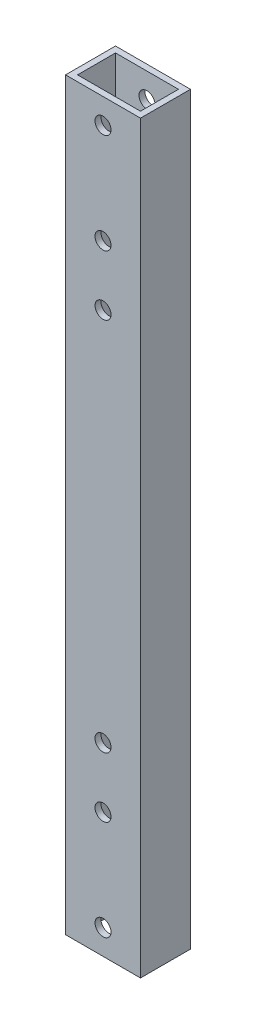
ISO-10303-21;
HEADER;
FILE_DESCRIPTION(('STEP AP214'),'2;1');
FILE_NAME('part.step','',(''),(''),'','','');
FILE_SCHEMA(('AUTOMOTIVE_DESIGN { 1 0 10303 214 1 1 1 1 }'));
ENDSEC;
DATA;
#1=APPLICATION_CONTEXT('core data for automotive mechanical design processes');
#2=APPLICATION_PROTOCOL_DEFINITION('international standard','automotive_design',2000,#1);
#3=PRODUCT_CONTEXT('',#1,'mechanical');
#4=PRODUCT('Part','Part','',(#3));
#5=PRODUCT_RELATED_PRODUCT_CATEGORY('part','',(#4));
#6=PRODUCT_DEFINITION_FORMATION('','',#4);
#7=PRODUCT_DEFINITION_CONTEXT('part definition',#1,'design');
#8=PRODUCT_DEFINITION('design','',#6,#7);
#9=PRODUCT_DEFINITION_SHAPE('','',#8);
#10=(LENGTH_UNIT() NAMED_UNIT(*) SI_UNIT(.MILLI.,.METRE.));
#11=(NAMED_UNIT(*) PLANE_ANGLE_UNIT() SI_UNIT($,.RADIAN.));
#12=(NAMED_UNIT(*) SI_UNIT($,.STERADIAN.) SOLID_ANGLE_UNIT());
#13=UNCERTAINTY_MEASURE_WITH_UNIT(LENGTH_MEASURE(1.E-05),#10,'distance_accuracy_value','');
#14=(GEOMETRIC_REPRESENTATION_CONTEXT(3) GLOBAL_UNCERTAINTY_ASSIGNED_CONTEXT((#13)) GLOBAL_UNIT_ASSIGNED_CONTEXT((#10,
#11,#12)) REPRESENTATION_CONTEXT('',''));
#15=CARTESIAN_POINT('',(0.,0.,0.));
#16=DIRECTION('',(0.,0.,1.));
#17=DIRECTION('',(1.,0.,0.));
#18=AXIS2_PLACEMENT_3D('',#15,#16,#17);
#19=CARTESIAN_POINT('',(0.,74.51,0.));
#20=DIRECTION('',(0.,1.,0.));
#21=DIRECTION('',(0.,0.,1.));
#22=AXIS2_PLACEMENT_3D('',#19,#20,#21);
#23=PLANE('',#22);
#24=DIRECTION('',(0.,0.,-1.));
#25=VECTOR('',#24,1.);
#26=CARTESIAN_POINT('',(7.5,74.51,-5.));
#27=LINE('',#26,#25);
#28=CARTESIAN_POINT('',(7.5,74.51,5.));
#29=VERTEX_POINT('',#28);
#30=CARTESIAN_POINT('',(7.5,74.51,-5.));
#31=VERTEX_POINT('',#30);
#32=EDGE_CURVE('E143',#29,#31,#27,.T.);
#33=ORIENTED_EDGE('',*,*,#32,.T.);
#34=DIRECTION('',(-1.,0.,0.));
#35=VECTOR('',#34,1.);
#36=CARTESIAN_POINT('',(-7.5,74.51,-5.));
#37=LINE('',#36,#35);
#38=CARTESIAN_POINT('',(-7.5,74.51,-5.));
#39=VERTEX_POINT('',#38);
#40=EDGE_CURVE('E146',#31,#39,#37,.T.);
#41=ORIENTED_EDGE('',*,*,#40,.T.);
#42=DIRECTION('',(0.,0.,1.));
#43=VECTOR('',#42,1.);
#44=CARTESIAN_POINT('',(-7.5,74.51,-5.));
#45=LINE('',#44,#43);
#46=CARTESIAN_POINT('',(-7.5,74.51,5.));
#47=VERTEX_POINT('',#46);
#48=EDGE_CURVE('E149',#39,#47,#45,.T.);
#49=ORIENTED_EDGE('',*,*,#48,.T.);
#50=DIRECTION('',(1.,0.,0.));
#51=VECTOR('',#50,1.);
#52=CARTESIAN_POINT('',(-7.5,74.51,5.));
#53=LINE('',#52,#51);
#54=EDGE_CURVE('E151',#47,#29,#53,.T.);
#55=ORIENTED_EDGE('',*,*,#54,.T.);
#56=EDGE_LOOP('',(#33,#41,#49,#55));
#57=FACE_BOUND('',#56,.T.);
#58=DIRECTION('',(1.,0.,0.));
#59=VECTOR('',#58,1.);
#60=CARTESIAN_POINT('',(-6.3,74.51,3.8));
#61=LINE('',#60,#59);
#62=CARTESIAN_POINT('',(-6.3,74.51,3.8));
#63=VERTEX_POINT('',#62);
#64=CARTESIAN_POINT('',(6.3,74.51,3.8));
#65=VERTEX_POINT('',#64);
#66=EDGE_CURVE('E113',#63,#65,#61,.T.);
#67=ORIENTED_EDGE('',*,*,#66,.F.);
#68=DIRECTION('',(0.,0.,1.));
#69=VECTOR('',#68,1.);
#70=CARTESIAN_POINT('',(-6.3,74.51,-3.8));
#71=LINE('',#70,#69);
#72=CARTESIAN_POINT('',(-6.3,74.51,-3.8));
#73=VERTEX_POINT('',#72);
#74=EDGE_CURVE('E105',#73,#63,#71,.T.);
#75=ORIENTED_EDGE('',*,*,#74,.F.);
#76=DIRECTION('',(-1.,0.,0.));
#77=VECTOR('',#76,1.);
#78=CARTESIAN_POINT('',(-6.3,74.51,-3.8));
#79=LINE('',#78,#77);
#80=CARTESIAN_POINT('',(6.3,74.51,-3.8));
#81=VERTEX_POINT('',#80);
#82=EDGE_CURVE('E127',#81,#73,#79,.T.);
#83=ORIENTED_EDGE('',*,*,#82,.F.);
#84=DIRECTION('',(0.,0.,-1.));
#85=VECTOR('',#84,1.);
#86=CARTESIAN_POINT('',(6.3,74.51,-3.8));
#87=LINE('',#86,#85);
#88=EDGE_CURVE('E125',#65,#81,#87,.T.);
#89=ORIENTED_EDGE('',*,*,#88,.F.);
#90=EDGE_LOOP('',(#67,#75,#83,#89));
#91=FACE_BOUND('',#90,.T.);
#92=ADVANCED_FACE('F38',(#57,#91),#23,.T.);
#93=CARTESIAN_POINT('',(0.,-74.51,0.));
#94=DIRECTION('',(0.,1.,0.));
#95=DIRECTION('',(0.,0.,1.));
#96=AXIS2_PLACEMENT_3D('',#93,#94,#95);
#97=PLANE('',#96);
#98=DIRECTION('',(0.,0.,-1.));
#99=VECTOR('',#98,1.);
#100=CARTESIAN_POINT('',(7.5,-74.51,-5.));
#101=LINE('',#100,#99);
#102=CARTESIAN_POINT('',(7.5,-74.51,5.));
#103=VERTEX_POINT('',#102);
#104=CARTESIAN_POINT('',(7.5,-74.51,-5.));
#105=VERTEX_POINT('',#104);
#106=EDGE_CURVE('E121',#103,#105,#101,.T.);
#107=ORIENTED_EDGE('',*,*,#106,.F.);
#108=DIRECTION('',(1.,0.,0.));
#109=VECTOR('',#108,1.);
#110=CARTESIAN_POINT('',(-7.5,-74.51,5.));
#111=LINE('',#110,#109);
#112=CARTESIAN_POINT('',(-7.5,-74.51,5.));
#113=VERTEX_POINT('',#112);
#114=EDGE_CURVE('E147',#113,#103,#111,.T.);
#115=ORIENTED_EDGE('',*,*,#114,.F.);
#116=DIRECTION('',(0.,0.,1.));
#117=VECTOR('',#116,1.);
#118=CARTESIAN_POINT('',(-7.5,-74.51,-5.));
#119=LINE('',#118,#117);
#120=CARTESIAN_POINT('',(-7.5,-74.51,-5.));
#121=VERTEX_POINT('',#120);
#122=EDGE_CURVE('E158',#121,#113,#119,.T.);
#123=ORIENTED_EDGE('',*,*,#122,.F.);
#124=DIRECTION('',(-1.,0.,0.));
#125=VECTOR('',#124,1.);
#126=CARTESIAN_POINT('',(-7.5,-74.51,-5.));
#127=LINE('',#126,#125);
#128=EDGE_CURVE('E156',#105,#121,#127,.T.);
#129=ORIENTED_EDGE('',*,*,#128,.F.);
#130=EDGE_LOOP('',(#107,#115,#123,#129));
#131=FACE_BOUND('',#130,.T.);
#132=DIRECTION('',(0.,0.,1.));
#133=VECTOR('',#132,1.);
#134=CARTESIAN_POINT('',(-6.3,-74.51,-3.8));
#135=LINE('',#134,#133);
#136=CARTESIAN_POINT('',(-6.3,-74.51,-3.8));
#137=VERTEX_POINT('',#136);
#138=CARTESIAN_POINT('',(-6.3,-74.51,3.8));
#139=VERTEX_POINT('',#138);
#140=EDGE_CURVE('E63',#137,#139,#135,.T.);
#141=ORIENTED_EDGE('',*,*,#140,.T.);
#142=DIRECTION('',(1.,0.,0.));
#143=VECTOR('',#142,1.);
#144=CARTESIAN_POINT('',(-6.3,-74.51,3.8));
#145=LINE('',#144,#143);
#146=CARTESIAN_POINT('',(6.3,-74.51,3.8));
#147=VERTEX_POINT('',#146);
#148=EDGE_CURVE('E120',#139,#147,#145,.T.);
#149=ORIENTED_EDGE('',*,*,#148,.T.);
#150=DIRECTION('',(0.,0.,-1.));
#151=VECTOR('',#150,1.);
#152=CARTESIAN_POINT('',(6.3,-74.51,-3.8));
#153=LINE('',#152,#151);
#154=CARTESIAN_POINT('',(6.3,-74.51,-3.8));
#155=VERTEX_POINT('',#154);
#156=EDGE_CURVE('E135',#147,#155,#153,.T.);
#157=ORIENTED_EDGE('',*,*,#156,.T.);
#158=DIRECTION('',(-1.,0.,0.));
#159=VECTOR('',#158,1.);
#160=CARTESIAN_POINT('',(-6.3,-74.51,-3.8));
#161=LINE('',#160,#159);
#162=EDGE_CURVE('E114',#155,#137,#161,.T.);
#163=ORIENTED_EDGE('',*,*,#162,.T.);
#164=EDGE_LOOP('',(#141,#149,#157,#163));
#165=FACE_BOUND('',#164,.T.);
#166=ADVANCED_FACE('F272',(#131,#165),#97,.F.);
#167=CARTESIAN_POINT('',(7.5,74.51,-5.));
#168=DIRECTION('',(-1.,0.,0.));
#169=DIRECTION('',(0.,0.,1.));
#170=AXIS2_PLACEMENT_3D('',#167,#168,#169);
#171=PLANE('',#170);
#172=ORIENTED_EDGE('',*,*,#106,.T.);
#173=DIRECTION('',(0.,-1.,0.));
#174=VECTOR('',#173,1.);
#175=CARTESIAN_POINT('',(7.5,74.51,-5.));
#176=LINE('',#175,#174);
#177=EDGE_CURVE('E11',#31,#105,#176,.T.);
#178=ORIENTED_EDGE('',*,*,#177,.F.);
#179=ORIENTED_EDGE('',*,*,#32,.F.);
#180=DIRECTION('',(0.,-1.,0.));
#181=VECTOR('',#180,1.);
#182=CARTESIAN_POINT('',(7.5,74.51,5.));
#183=LINE('',#182,#181);
#184=EDGE_CURVE('E153',#29,#103,#183,.T.);
#185=ORIENTED_EDGE('',*,*,#184,.T.);
#186=EDGE_LOOP('',(#172,#178,#179,#185));
#187=FACE_BOUND('',#186,.T.);
#188=ADVANCED_FACE('F40',(#187),#171,.F.);
#189=CARTESIAN_POINT('',(-7.5,74.51,-5.));
#190=DIRECTION('',(0.,0.,1.));
#191=DIRECTION('',(1.,0.,0.));
#192=AXIS2_PLACEMENT_3D('',#189,#190,#191);
#193=PLANE('',#192);
#194=CARTESIAN_POINT('',(0.,37.5,-5.));
#195=DIRECTION('',(0.,0.,-1.));
#196=DIRECTION('',(-1.,0.,0.));
#197=AXIS2_PLACEMENT_3D('',#194,#195,#196);
#198=CIRCLE('',#197,1.6);
#199=CARTESIAN_POINT('',(-1.6,37.5,-5.));
#200=VERTEX_POINT('',#199);
#201=EDGE_CURVE('E193',#200,#200,#198,.T.);
#202=ORIENTED_EDGE('',*,*,#201,.F.);
#203=EDGE_LOOP('',(#202));
#204=FACE_BOUND('',#203,.T.);
#205=CARTESIAN_POINT('',(0.,-37.5,-5.));
#206=DIRECTION('',(0.,0.,-1.));
#207=DIRECTION('',(1.,0.,0.));
#208=AXIS2_PLACEMENT_3D('',#205,#206,#207);
#209=CIRCLE('',#208,1.6);
#210=CARTESIAN_POINT('',(1.6,-37.5,-5.));
#211=VERTEX_POINT('',#210);
#212=EDGE_CURVE('E198',#211,#211,#209,.T.);
#213=ORIENTED_EDGE('',*,*,#212,.F.);
#214=EDGE_LOOP('',(#213));
#215=FACE_BOUND('',#214,.T.);
#216=CARTESIAN_POINT('',(0.,-49.51,-5.));
#217=DIRECTION('',(0.,0.,-1.));
#218=DIRECTION('',(1.,0.,0.));
#219=AXIS2_PLACEMENT_3D('',#216,#217,#218);
#220=CIRCLE('',#219,1.6);
#221=CARTESIAN_POINT('',(1.6,-49.51,-5.));
#222=VERTEX_POINT('',#221);
#223=EDGE_CURVE('E180',#222,#222,#220,.T.);
#224=ORIENTED_EDGE('',*,*,#223,.F.);
#225=EDGE_LOOP('',(#224));
#226=FACE_BOUND('',#225,.T.);
#227=CARTESIAN_POINT('',(0.,-69.51,-5.));
#228=DIRECTION('',(0.,0.,-1.));
#229=DIRECTION('',(1.,0.,0.));
#230=AXIS2_PLACEMENT_3D('',#227,#228,#229);
#231=CIRCLE('',#230,1.6);
#232=CARTESIAN_POINT('',(1.6,-69.51,-5.));
#233=VERTEX_POINT('',#232);
#234=EDGE_CURVE('E215',#233,#233,#231,.T.);
#235=ORIENTED_EDGE('',*,*,#234,.F.);
#236=EDGE_LOOP('',(#235));
#237=FACE_BOUND('',#236,.T.);
#238=CARTESIAN_POINT('',(0.,49.51,-5.));
#239=DIRECTION('',(0.,0.,1.));
#240=DIRECTION('',(1.,0.,0.));
#241=AXIS2_PLACEMENT_3D('',#238,#239,#240);
#242=CIRCLE('',#241,1.6);
#243=CARTESIAN_POINT('',(1.6,49.51,-5.));
#244=VERTEX_POINT('',#243);
#245=EDGE_CURVE('E172',#244,#244,#242,.T.);
#246=ORIENTED_EDGE('',*,*,#245,.T.);
#247=EDGE_LOOP('',(#246));
#248=FACE_BOUND('',#247,.T.);
#249=CARTESIAN_POINT('',(0.,69.51,-5.));
#250=DIRECTION('',(0.,0.,1.));
#251=DIRECTION('',(1.,0.,0.));
#252=AXIS2_PLACEMENT_3D('',#249,#250,#251);
#253=CIRCLE('',#252,1.6);
#254=CARTESIAN_POINT('',(1.6,69.51,-5.));
#255=VERTEX_POINT('',#254);
#256=EDGE_CURVE('E230',#255,#255,#253,.T.);
#257=ORIENTED_EDGE('',*,*,#256,.T.);
#258=EDGE_LOOP('',(#257));
#259=FACE_BOUND('',#258,.T.);
#260=ORIENTED_EDGE('',*,*,#128,.T.);
#261=DIRECTION('',(0.,-1.,0.));
#262=VECTOR('',#261,1.);
#263=CARTESIAN_POINT('',(-7.5,74.51,-5.));
#264=LINE('',#263,#262);
#265=EDGE_CURVE('E47',#39,#121,#264,.T.);
#266=ORIENTED_EDGE('',*,*,#265,.F.);
#267=ORIENTED_EDGE('',*,*,#40,.F.);
#268=ORIENTED_EDGE('',*,*,#177,.T.);
#269=EDGE_LOOP('',(#260,#266,#267,#268));
#270=FACE_BOUND('',#269,.T.);
#271=ADVANCED_FACE('F276',(#204,#215,#226,#237,#248,#259,#270),#193,.F.);
#272=CARTESIAN_POINT('',(-7.5,74.51,-5.));
#273=DIRECTION('',(1.,0.,0.));
#274=DIRECTION('',(0.,0.,-1.));
#275=AXIS2_PLACEMENT_3D('',#272,#273,#274);
#276=PLANE('',#275);
#277=ORIENTED_EDGE('',*,*,#122,.T.);
#278=DIRECTION('',(0.,-1.,0.));
#279=VECTOR('',#278,1.);
#280=CARTESIAN_POINT('',(-7.5,74.51,5.));
#281=LINE('',#280,#279);
#282=EDGE_CURVE('E163',#47,#113,#281,.T.);
#283=ORIENTED_EDGE('',*,*,#282,.F.);
#284=ORIENTED_EDGE('',*,*,#48,.F.);
#285=ORIENTED_EDGE('',*,*,#265,.T.);
#286=EDGE_LOOP('',(#277,#283,#284,#285));
#287=FACE_BOUND('',#286,.T.);
#288=ADVANCED_FACE('F260',(#287),#276,.F.);
#289=CARTESIAN_POINT('',(-7.5,74.51,5.));
#290=DIRECTION('',(0.,0.,-1.));
#291=DIRECTION('',(-1.,0.,0.));
#292=AXIS2_PLACEMENT_3D('',#289,#290,#291);
#293=PLANE('',#292);
#294=CARTESIAN_POINT('',(0.,37.5,5.));
#295=DIRECTION('',(0.,0.,-1.));
#296=DIRECTION('',(-1.,0.,0.));
#297=AXIS2_PLACEMENT_3D('',#294,#295,#296);
#298=CIRCLE('',#297,1.6);
#299=CARTESIAN_POINT('',(-1.6,37.5,5.));
#300=VERTEX_POINT('',#299);
#301=EDGE_CURVE('E187',#300,#300,#298,.T.);
#302=ORIENTED_EDGE('',*,*,#301,.T.);
#303=EDGE_LOOP('',(#302));
#304=FACE_BOUND('',#303,.T.);
#305=CARTESIAN_POINT('',(0.,-37.5,5.));
#306=DIRECTION('',(0.,0.,-1.));
#307=DIRECTION('',(1.,0.,0.));
#308=AXIS2_PLACEMENT_3D('',#305,#306,#307);
#309=CIRCLE('',#308,1.6);
#310=CARTESIAN_POINT('',(1.6,-37.5,5.));
#311=VERTEX_POINT('',#310);
#312=EDGE_CURVE('E203',#311,#311,#309,.T.);
#313=ORIENTED_EDGE('',*,*,#312,.T.);
#314=EDGE_LOOP('',(#313));
#315=FACE_BOUND('',#314,.T.);
#316=CARTESIAN_POINT('',(0.,-49.51,5.));
#317=DIRECTION('',(0.,0.,-1.));
#318=DIRECTION('',(1.,0.,0.));
#319=AXIS2_PLACEMENT_3D('',#316,#317,#318);
#320=CIRCLE('',#319,1.6);
#321=CARTESIAN_POINT('',(1.6,-49.51,5.));
#322=VERTEX_POINT('',#321);
#323=EDGE_CURVE('E212',#322,#322,#320,.T.);
#324=ORIENTED_EDGE('',*,*,#323,.T.);
#325=EDGE_LOOP('',(#324));
#326=FACE_BOUND('',#325,.T.);
#327=CARTESIAN_POINT('',(0.,-69.51,5.));
#328=DIRECTION('',(0.,0.,-1.));
#329=DIRECTION('',(1.,0.,0.));
#330=AXIS2_PLACEMENT_3D('',#327,#328,#329);
#331=CIRCLE('',#330,1.6);
#332=CARTESIAN_POINT('',(1.6,-69.51,5.));
#333=VERTEX_POINT('',#332);
#334=EDGE_CURVE('E209',#333,#333,#331,.T.);
#335=ORIENTED_EDGE('',*,*,#334,.T.);
#336=EDGE_LOOP('',(#335));
#337=FACE_BOUND('',#336,.T.);
#338=CARTESIAN_POINT('',(0.,49.51,5.));
#339=DIRECTION('',(0.,0.,1.));
#340=DIRECTION('',(1.,0.,0.));
#341=AXIS2_PLACEMENT_3D('',#338,#339,#340);
#342=CIRCLE('',#341,1.6);
#343=CARTESIAN_POINT('',(1.6,49.51,5.));
#344=VERTEX_POINT('',#343);
#345=EDGE_CURVE('E227',#344,#344,#342,.T.);
#346=ORIENTED_EDGE('',*,*,#345,.F.);
#347=EDGE_LOOP('',(#346));
#348=FACE_BOUND('',#347,.T.);
#349=CARTESIAN_POINT('',(0.,69.51,5.));
#350=DIRECTION('',(0.,0.,1.));
#351=DIRECTION('',(1.,0.,0.));
#352=AXIS2_PLACEMENT_3D('',#349,#350,#351);
#353=CIRCLE('',#352,1.6);
#354=CARTESIAN_POINT('',(1.6,69.51,5.));
#355=VERTEX_POINT('',#354);
#356=EDGE_CURVE('E224',#355,#355,#353,.T.);
#357=ORIENTED_EDGE('',*,*,#356,.F.);
#358=EDGE_LOOP('',(#357));
#359=FACE_BOUND('',#358,.T.);
#360=ORIENTED_EDGE('',*,*,#114,.T.);
#361=ORIENTED_EDGE('',*,*,#184,.F.);
#362=ORIENTED_EDGE('',*,*,#54,.F.);
#363=ORIENTED_EDGE('',*,*,#282,.T.);
#364=EDGE_LOOP('',(#360,#361,#362,#363));
#365=FACE_BOUND('',#364,.T.);
#366=ADVANCED_FACE('F257',(#304,#315,#326,#337,#348,#359,#365),#293,.F.);
#367=CARTESIAN_POINT('',(-6.3,74.51,-3.8));
#368=DIRECTION('',(1.,0.,0.));
#369=DIRECTION('',(0.,0.,-1.));
#370=AXIS2_PLACEMENT_3D('',#367,#368,#369);
#371=PLANE('',#370);
#372=ORIENTED_EDGE('',*,*,#140,.F.);
#373=DIRECTION('',(0.,-1.,0.));
#374=VECTOR('',#373,1.);
#375=CARTESIAN_POINT('',(-6.3,74.51,-3.8));
#376=LINE('',#375,#374);
#377=EDGE_CURVE('E109',#73,#137,#376,.T.);
#378=ORIENTED_EDGE('',*,*,#377,.F.);
#379=ORIENTED_EDGE('',*,*,#74,.T.);
#380=DIRECTION('',(0.,-1.,0.));
#381=VECTOR('',#380,1.);
#382=CARTESIAN_POINT('',(-6.3,74.51,3.8));
#383=LINE('',#382,#381);
#384=EDGE_CURVE('E108',#63,#139,#383,.T.);
#385=ORIENTED_EDGE('',*,*,#384,.T.);
#386=EDGE_LOOP('',(#372,#378,#379,#385));
#387=FACE_BOUND('',#386,.T.);
#388=ADVANCED_FACE('F107',(#387),#371,.T.);
#389=CARTESIAN_POINT('',(-6.3,74.51,3.8));
#390=DIRECTION('',(0.,0.,-1.));
#391=DIRECTION('',(-1.,0.,0.));
#392=AXIS2_PLACEMENT_3D('',#389,#390,#391);
#393=PLANE('',#392);
#394=CARTESIAN_POINT('',(0.,37.5,3.8));
#395=DIRECTION('',(0.,0.,-1.));
#396=DIRECTION('',(-1.,0.,0.));
#397=AXIS2_PLACEMENT_3D('',#394,#395,#396);
#398=CIRCLE('',#397,1.6);
#399=CARTESIAN_POINT('',(-1.6,37.5,3.8));
#400=VERTEX_POINT('',#399);
#401=EDGE_CURVE('E206',#400,#400,#398,.T.);
#402=ORIENTED_EDGE('',*,*,#401,.F.);
#403=EDGE_LOOP('',(#402));
#404=FACE_BOUND('',#403,.T.);
#405=CARTESIAN_POINT('',(0.,-37.5,3.8));
#406=DIRECTION('',(0.,0.,-1.));
#407=DIRECTION('',(-1.,0.,0.));
#408=AXIS2_PLACEMENT_3D('',#405,#406,#407);
#409=CIRCLE('',#408,1.6);
#410=CARTESIAN_POINT('',(-1.6,-37.5,3.8));
#411=VERTEX_POINT('',#410);
#412=EDGE_CURVE('E186',#411,#411,#409,.T.);
#413=ORIENTED_EDGE('',*,*,#412,.F.);
#414=EDGE_LOOP('',(#413));
#415=FACE_BOUND('',#414,.T.);
#416=CARTESIAN_POINT('',(0.,-49.51,3.8));
#417=DIRECTION('',(0.,0.,-1.));
#418=DIRECTION('',(-1.,0.,0.));
#419=AXIS2_PLACEMENT_3D('',#416,#417,#418);
#420=CIRCLE('',#419,1.6);
#421=CARTESIAN_POINT('',(-1.6,-49.51,3.8));
#422=VERTEX_POINT('',#421);
#423=EDGE_CURVE('E183',#422,#422,#420,.F.);
#424=ORIENTED_EDGE('',*,*,#423,.T.);
#425=EDGE_LOOP('',(#424));
#426=FACE_BOUND('',#425,.T.);
#427=CARTESIAN_POINT('',(0.,-69.51,3.8));
#428=DIRECTION('',(0.,0.,-1.));
#429=DIRECTION('',(-1.,0.,0.));
#430=AXIS2_PLACEMENT_3D('',#427,#428,#429);
#431=CIRCLE('',#430,1.6);
#432=CARTESIAN_POINT('',(-1.6,-69.51,3.8));
#433=VERTEX_POINT('',#432);
#434=EDGE_CURVE('E179',#433,#433,#431,.F.);
#435=ORIENTED_EDGE('',*,*,#434,.T.);
#436=EDGE_LOOP('',(#435));
#437=FACE_BOUND('',#436,.T.);
#438=CARTESIAN_POINT('',(0.,49.51,3.8));
#439=DIRECTION('',(0.,0.,-1.));
#440=DIRECTION('',(-1.,0.,0.));
#441=AXIS2_PLACEMENT_3D('',#438,#439,#440);
#442=CIRCLE('',#441,1.6);
#443=CARTESIAN_POINT('',(-1.6,49.51,3.8));
#444=VERTEX_POINT('',#443);
#445=EDGE_CURVE('E133',#444,#444,#442,.T.);
#446=ORIENTED_EDGE('',*,*,#445,.F.);
#447=EDGE_LOOP('',(#446));
#448=FACE_BOUND('',#447,.T.);
#449=CARTESIAN_POINT('',(0.,69.51,3.8));
#450=DIRECTION('',(0.,0.,-1.));
#451=DIRECTION('',(-1.,0.,0.));
#452=AXIS2_PLACEMENT_3D('',#449,#450,#451);
#453=CIRCLE('',#452,1.6);
#454=CARTESIAN_POINT('',(-1.6,69.51,3.8));
#455=VERTEX_POINT('',#454);
#456=EDGE_CURVE('E171',#455,#455,#453,.T.);
#457=ORIENTED_EDGE('',*,*,#456,.F.);
#458=EDGE_LOOP('',(#457));
#459=FACE_BOUND('',#458,.T.);
#460=ORIENTED_EDGE('',*,*,#148,.F.);
#461=ORIENTED_EDGE('',*,*,#384,.F.);
#462=ORIENTED_EDGE('',*,*,#66,.T.);
#463=DIRECTION('',(0.,-1.,0.));
#464=VECTOR('',#463,1.);
#465=CARTESIAN_POINT('',(6.3,74.51,3.8));
#466=LINE('',#465,#464);
#467=EDGE_CURVE('E122',#65,#147,#466,.T.);
#468=ORIENTED_EDGE('',*,*,#467,.T.);
#469=EDGE_LOOP('',(#460,#461,#462,#468));
#470=FACE_BOUND('',#469,.T.);
#471=ADVANCED_FACE('F117',(#404,#415,#426,#437,#448,#459,#470),#393,.T.);
#472=CARTESIAN_POINT('',(6.3,74.51,-3.8));
#473=DIRECTION('',(-1.,0.,0.));
#474=DIRECTION('',(0.,0.,1.));
#475=AXIS2_PLACEMENT_3D('',#472,#473,#474);
#476=PLANE('',#475);
#477=ORIENTED_EDGE('',*,*,#156,.F.);
#478=ORIENTED_EDGE('',*,*,#467,.F.);
#479=ORIENTED_EDGE('',*,*,#88,.T.);
#480=DIRECTION('',(0.,-1.,0.));
#481=VECTOR('',#480,1.);
#482=CARTESIAN_POINT('',(6.3,74.51,-3.8));
#483=LINE('',#482,#481);
#484=EDGE_CURVE('E55',#81,#155,#483,.T.);
#485=ORIENTED_EDGE('',*,*,#484,.T.);
#486=EDGE_LOOP('',(#477,#478,#479,#485));
#487=FACE_BOUND('',#486,.T.);
#488=ADVANCED_FACE('F244',(#487),#476,.T.);
#489=CARTESIAN_POINT('',(-6.3,74.51,-3.8));
#490=DIRECTION('',(0.,0.,1.));
#491=DIRECTION('',(1.,0.,0.));
#492=AXIS2_PLACEMENT_3D('',#489,#490,#491);
#493=PLANE('',#492);
#494=CARTESIAN_POINT('',(0.,37.5,-3.8));
#495=DIRECTION('',(0.,0.,1.));
#496=DIRECTION('',(1.,0.,0.));
#497=AXIS2_PLACEMENT_3D('',#494,#495,#496);
#498=CIRCLE('',#497,1.6);
#499=CARTESIAN_POINT('',(1.6,37.5,-3.8));
#500=VERTEX_POINT('',#499);
#501=EDGE_CURVE('E42',#500,#500,#498,.T.);
#502=ORIENTED_EDGE('',*,*,#501,.F.);
#503=EDGE_LOOP('',(#502));
#504=FACE_BOUND('',#503,.T.);
#505=CARTESIAN_POINT('',(0.,-37.5,-3.8));
#506=DIRECTION('',(0.,0.,1.));
#507=DIRECTION('',(1.,0.,0.));
#508=AXIS2_PLACEMENT_3D('',#505,#506,#507);
#509=CIRCLE('',#508,1.6);
#510=CARTESIAN_POINT('',(1.6,-37.5,-3.8));
#511=VERTEX_POINT('',#510);
#512=EDGE_CURVE('E184',#511,#511,#509,.T.);
#513=ORIENTED_EDGE('',*,*,#512,.F.);
#514=EDGE_LOOP('',(#513));
#515=FACE_BOUND('',#514,.T.);
#516=CARTESIAN_POINT('',(0.,-49.51,-3.8));
#517=DIRECTION('',(0.,0.,1.));
#518=DIRECTION('',(1.,0.,0.));
#519=AXIS2_PLACEMENT_3D('',#516,#517,#518);
#520=CIRCLE('',#519,1.6);
#521=CARTESIAN_POINT('',(1.6,-49.51,-3.8));
#522=VERTEX_POINT('',#521);
#523=EDGE_CURVE('E181',#522,#522,#520,.F.);
#524=ORIENTED_EDGE('',*,*,#523,.T.);
#525=EDGE_LOOP('',(#524));
#526=FACE_BOUND('',#525,.T.);
#527=CARTESIAN_POINT('',(0.,-69.51,-3.8));
#528=DIRECTION('',(0.,0.,1.));
#529=DIRECTION('',(1.,0.,0.));
#530=AXIS2_PLACEMENT_3D('',#527,#528,#529);
#531=CIRCLE('',#530,1.6);
#532=CARTESIAN_POINT('',(1.6,-69.51,-3.8));
#533=VERTEX_POINT('',#532);
#534=EDGE_CURVE('E176',#533,#533,#531,.F.);
#535=ORIENTED_EDGE('',*,*,#534,.T.);
#536=EDGE_LOOP('',(#535));
#537=FACE_BOUND('',#536,.T.);
#538=CARTESIAN_POINT('',(0.,49.51,-3.8));
#539=DIRECTION('',(0.,0.,1.));
#540=DIRECTION('',(1.,0.,0.));
#541=AXIS2_PLACEMENT_3D('',#538,#539,#540);
#542=CIRCLE('',#541,1.6);
#543=CARTESIAN_POINT('',(1.6,49.51,-3.8));
#544=VERTEX_POINT('',#543);
#545=EDGE_CURVE('E173',#544,#544,#542,.T.);
#546=ORIENTED_EDGE('',*,*,#545,.F.);
#547=EDGE_LOOP('',(#546));
#548=FACE_BOUND('',#547,.T.);
#549=CARTESIAN_POINT('',(0.,69.51,-3.8));
#550=DIRECTION('',(0.,0.,1.));
#551=DIRECTION('',(1.,0.,0.));
#552=AXIS2_PLACEMENT_3D('',#549,#550,#551);
#553=CIRCLE('',#552,1.6);
#554=CARTESIAN_POINT('',(1.6,69.51,-3.8));
#555=VERTEX_POINT('',#554);
#556=EDGE_CURVE('E168',#555,#555,#553,.T.);
#557=ORIENTED_EDGE('',*,*,#556,.F.);
#558=EDGE_LOOP('',(#557));
#559=FACE_BOUND('',#558,.T.);
#560=ORIENTED_EDGE('',*,*,#162,.F.);
#561=ORIENTED_EDGE('',*,*,#484,.F.);
#562=ORIENTED_EDGE('',*,*,#82,.T.);
#563=ORIENTED_EDGE('',*,*,#377,.T.);
#564=EDGE_LOOP('',(#560,#561,#562,#563));
#565=FACE_BOUND('',#564,.T.);
#566=ADVANCED_FACE('F298',(#504,#515,#526,#537,#548,#559,#565),#493,.T.);
#567=CARTESIAN_POINT('',(0.,69.51,-5.));
#568=DIRECTION('',(0.,0.,1.));
#569=DIRECTION('',(1.,0.,0.));
#570=AXIS2_PLACEMENT_3D('',#567,#568,#569);
#571=CYLINDRICAL_SURFACE('',#570,1.6);
#572=ORIENTED_EDGE('',*,*,#556,.T.);
#573=EDGE_LOOP('',(#572));
#574=FACE_BOUND('',#573,.T.);
#575=ORIENTED_EDGE('',*,*,#256,.F.);
#576=EDGE_LOOP('',(#575));
#577=FACE_BOUND('',#576,.T.);
#578=ADVANCED_FACE('F254',(#574,#577),#571,.F.);
#579=CARTESIAN_POINT('',(0.,49.51,-5.));
#580=DIRECTION('',(0.,0.,1.));
#581=DIRECTION('',(1.,0.,0.));
#582=AXIS2_PLACEMENT_3D('',#579,#580,#581);
#583=CYLINDRICAL_SURFACE('',#582,1.6);
#584=ORIENTED_EDGE('',*,*,#545,.T.);
#585=EDGE_LOOP('',(#584));
#586=FACE_BOUND('',#585,.T.);
#587=ORIENTED_EDGE('',*,*,#245,.F.);
#588=EDGE_LOOP('',(#587));
#589=FACE_BOUND('',#588,.T.);
#590=ADVANCED_FACE('F252',(#586,#589),#583,.F.);
#591=ORIENTED_EDGE('',*,*,#456,.T.);
#592=EDGE_LOOP('',(#591));
#593=FACE_BOUND('',#592,.T.);
#594=ORIENTED_EDGE('',*,*,#356,.T.);
#595=EDGE_LOOP('',(#594));
#596=FACE_BOUND('',#595,.T.);
#597=ADVANCED_FACE('F249',(#593,#596),#571,.F.);
#598=ORIENTED_EDGE('',*,*,#445,.T.);
#599=EDGE_LOOP('',(#598));
#600=FACE_BOUND('',#599,.T.);
#601=ORIENTED_EDGE('',*,*,#345,.T.);
#602=EDGE_LOOP('',(#601));
#603=FACE_BOUND('',#602,.T.);
#604=ADVANCED_FACE('F239',(#600,#603),#583,.F.);
#605=CARTESIAN_POINT('',(0.,-69.51,-5.));
#606=DIRECTION('',(0.,0.,1.));
#607=DIRECTION('',(1.,0.,0.));
#608=AXIS2_PLACEMENT_3D('',#605,#606,#607);
#609=CYLINDRICAL_SURFACE('',#608,1.6);
#610=ORIENTED_EDGE('',*,*,#534,.F.);
#611=EDGE_LOOP('',(#610));
#612=FACE_BOUND('',#611,.T.);
#613=ORIENTED_EDGE('',*,*,#234,.T.);
#614=EDGE_LOOP('',(#613));
#615=FACE_BOUND('',#614,.T.);
#616=ADVANCED_FACE('F308',(#612,#615),#609,.F.);
#617=CARTESIAN_POINT('',(0.,-49.51,-5.));
#618=DIRECTION('',(0.,0.,1.));
#619=DIRECTION('',(1.,0.,0.));
#620=AXIS2_PLACEMENT_3D('',#617,#618,#619);
#621=CYLINDRICAL_SURFACE('',#620,1.6);
#622=ORIENTED_EDGE('',*,*,#523,.F.);
#623=EDGE_LOOP('',(#622));
#624=FACE_BOUND('',#623,.T.);
#625=ORIENTED_EDGE('',*,*,#223,.T.);
#626=EDGE_LOOP('',(#625));
#627=FACE_BOUND('',#626,.T.);
#628=ADVANCED_FACE('F311',(#624,#627),#621,.F.);
#629=ORIENTED_EDGE('',*,*,#434,.F.);
#630=EDGE_LOOP('',(#629));
#631=FACE_BOUND('',#630,.T.);
#632=ORIENTED_EDGE('',*,*,#334,.F.);
#633=EDGE_LOOP('',(#632));
#634=FACE_BOUND('',#633,.T.);
#635=ADVANCED_FACE('F313',(#631,#634),#609,.F.);
#636=ORIENTED_EDGE('',*,*,#423,.F.);
#637=EDGE_LOOP('',(#636));
#638=FACE_BOUND('',#637,.T.);
#639=ORIENTED_EDGE('',*,*,#323,.F.);
#640=EDGE_LOOP('',(#639));
#641=FACE_BOUND('',#640,.T.);
#642=ADVANCED_FACE('F317',(#638,#641),#621,.F.);
#643=CARTESIAN_POINT('',(0.,-37.5,5.));
#644=DIRECTION('',(0.,0.,-1.));
#645=DIRECTION('',(-1.,0.,0.));
#646=AXIS2_PLACEMENT_3D('',#643,#644,#645);
#647=CYLINDRICAL_SURFACE('',#646,1.6);
#648=ORIENTED_EDGE('',*,*,#512,.T.);
#649=EDGE_LOOP('',(#648));
#650=FACE_BOUND('',#649,.T.);
#651=ORIENTED_EDGE('',*,*,#212,.T.);
#652=EDGE_LOOP('',(#651));
#653=FACE_BOUND('',#652,.T.);
#654=ADVANCED_FACE('F318',(#650,#653),#647,.F.);
#655=CARTESIAN_POINT('',(0.,37.5,5.));
#656=DIRECTION('',(0.,0.,-1.));
#657=DIRECTION('',(-1.,0.,0.));
#658=AXIS2_PLACEMENT_3D('',#655,#656,#657);
#659=CYLINDRICAL_SURFACE('',#658,1.6);
#660=ORIENTED_EDGE('',*,*,#501,.T.);
#661=EDGE_LOOP('',(#660));
#662=FACE_BOUND('',#661,.T.);
#663=ORIENTED_EDGE('',*,*,#201,.T.);
#664=EDGE_LOOP('',(#663));
#665=FACE_BOUND('',#664,.T.);
#666=ADVANCED_FACE('F321',(#662,#665),#659,.F.);
#667=ORIENTED_EDGE('',*,*,#412,.T.);
#668=EDGE_LOOP('',(#667));
#669=FACE_BOUND('',#668,.T.);
#670=ORIENTED_EDGE('',*,*,#312,.F.);
#671=EDGE_LOOP('',(#670));
#672=FACE_BOUND('',#671,.T.);
#673=ADVANCED_FACE('F322',(#669,#672),#647,.F.);
#674=ORIENTED_EDGE('',*,*,#401,.T.);
#675=EDGE_LOOP('',(#674));
#676=FACE_BOUND('',#675,.T.);
#677=ORIENTED_EDGE('',*,*,#301,.F.);
#678=EDGE_LOOP('',(#677));
#679=FACE_BOUND('',#678,.T.);
#680=ADVANCED_FACE('F325',(#676,#679),#659,.F.);
#681=CLOSED_SHELL('',(#92,#166,#188,#271,#288,#366,#388,#471,#488,#566,#578,#590,#597,#604,#616,
#628,#635,#642,#654,#666,#673,#680));
#682=MANIFOLD_SOLID_BREP('B2',#681);
#683=ADVANCED_BREP_SHAPE_REPRESENTATION('',(#18,#682),#14);
#684=SHAPE_DEFINITION_REPRESENTATION(#9,#683);
ENDSEC;
END-ISO-10303-21;
